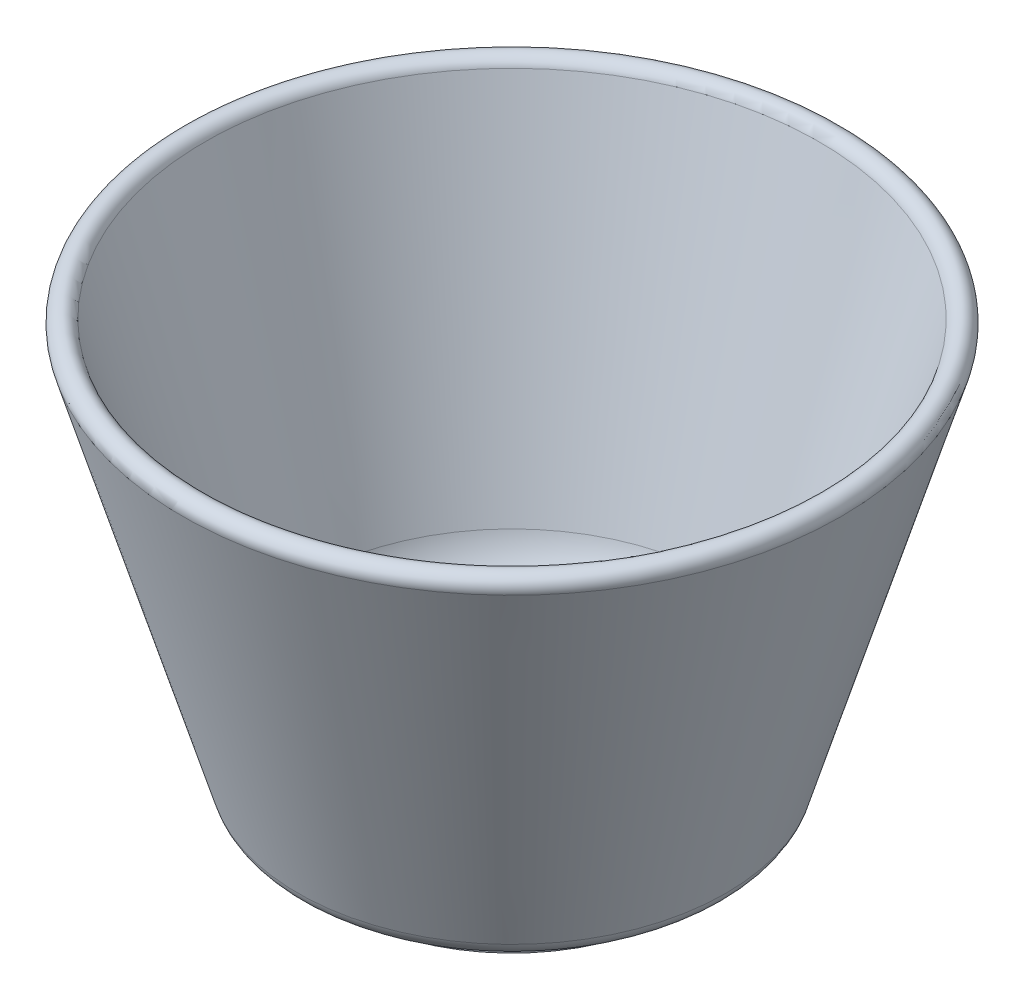
ISO-10303-21;
HEADER;
FILE_DESCRIPTION(('STEP AP214'),'2;1');
FILE_NAME('part.step','',(''),(''),'','','');
FILE_SCHEMA(('AUTOMOTIVE_DESIGN { 1 0 10303 214 1 1 1 1 }'));
ENDSEC;
DATA;
#1=APPLICATION_CONTEXT('core data for automotive mechanical design processes');
#2=APPLICATION_PROTOCOL_DEFINITION('international standard','automotive_design',2000,#1);
#3=PRODUCT_CONTEXT('',#1,'mechanical');
#4=PRODUCT('Part','Part','',(#3));
#5=PRODUCT_RELATED_PRODUCT_CATEGORY('part','',(#4));
#6=PRODUCT_DEFINITION_FORMATION('','',#4);
#7=PRODUCT_DEFINITION_CONTEXT('part definition',#1,'design');
#8=PRODUCT_DEFINITION('design','',#6,#7);
#9=PRODUCT_DEFINITION_SHAPE('','',#8);
#10=(LENGTH_UNIT() NAMED_UNIT(*) SI_UNIT(.MILLI.,.METRE.));
#11=(NAMED_UNIT(*) PLANE_ANGLE_UNIT() SI_UNIT($,.RADIAN.));
#12=(NAMED_UNIT(*) SI_UNIT($,.STERADIAN.) SOLID_ANGLE_UNIT());
#13=UNCERTAINTY_MEASURE_WITH_UNIT(LENGTH_MEASURE(1.E-05),#10,'distance_accuracy_value','');
#14=(GEOMETRIC_REPRESENTATION_CONTEXT(3) GLOBAL_UNCERTAINTY_ASSIGNED_CONTEXT((#13)) GLOBAL_UNIT_ASSIGNED_CONTEXT((#10,
#11,#12)) REPRESENTATION_CONTEXT('',''));
#15=CARTESIAN_POINT('',(0.,0.,0.));
#16=DIRECTION('',(0.,0.,1.));
#17=DIRECTION('',(1.,0.,0.));
#18=AXIS2_PLACEMENT_3D('',#15,#16,#17);
#19=CARTESIAN_POINT('',(-1.66533453693773E-13,49.5689781716506,0.));
#20=DIRECTION('',(0.,-1.,0.));
#21=DIRECTION('',(1.,0.,0.));
#22=AXIS2_PLACEMENT_3D('',#19,#20,#21);
#23=TOROIDAL_SURFACE('',#22,41.4367394278316,1.49999999999999);
#24=CARTESIAN_POINT('',(-1.68555425553902E-13,49.1379563433011,0.));
#25=DIRECTION('',(0.,-1.,0.));
#26=DIRECTION('',(1.,0.,0.));
#27=AXIS2_PLACEMENT_3D('',#24,#25,#26);
#28=CIRCLE('',#27,42.8734788556633);
#29=CARTESIAN_POINT('',(42.8734788556631,49.1379563433012,0.));
#30=VERTEX_POINT('',#29);
#31=EDGE_CURVE('E58',#30,#30,#28,.T.);
#32=ORIENTED_EDGE('',*,*,#31,.F.);
#33=EDGE_LOOP('',(#32));
#34=FACE_BOUND('',#33,.T.);
#35=CARTESIAN_POINT('',(-1.7151244994429E-13,50.0000000000003,0.));
#36=DIRECTION('',(0.,-1.,0.));
#37=DIRECTION('',(1.,0.,0.));
#38=AXIS2_PLACEMENT_3D('',#35,#36,#37);
#39=CIRCLE('',#38,39.9999999999998);
#40=CARTESIAN_POINT('',(39.9999999999997,50.0000000000004,0.));
#41=VERTEX_POINT('',#40);
#42=EDGE_CURVE('E79',#41,#41,#39,.T.);
#43=ORIENTED_EDGE('',*,*,#42,.T.);
#44=EDGE_LOOP('',(#43));
#45=FACE_BOUND('',#44,.T.);
#46=ADVANCED_FACE('F38',(#34,#45),#23,.T.);
#47=CARTESIAN_POINT('',(-1.68555425553902E-13,49.1379563433011,0.));
#48=DIRECTION('',(0.,1.,0.));
#49=DIRECTION('',(-1.,0.,0.));
#50=AXIS2_PLACEMENT_3D('',#47,#48,#49);
#51=CONICAL_SURFACE('',#50,42.8734788556633,0.291456794477864);
#52=CARTESIAN_POINT('',(0.,-0.862043656698952,0.));
#53=DIRECTION('',(0.,-1.,0.));
#54=DIRECTION('',(1.,0.,0.));
#55=AXIS2_PLACEMENT_3D('',#52,#53,#54);
#56=CIRCLE('',#55,27.8734788556635);
#57=CARTESIAN_POINT('',(27.8734788556635,-0.862043656698856,0.));
#58=VERTEX_POINT('',#57);
#59=EDGE_CURVE('E61',#58,#58,#56,.T.);
#60=ORIENTED_EDGE('',*,*,#59,.F.);
#61=EDGE_LOOP('',(#60));
#62=FACE_BOUND('',#61,.T.);
#63=ORIENTED_EDGE('',*,*,#31,.T.);
#64=EDGE_LOOP('',(#63));
#65=FACE_BOUND('',#64,.T.);
#66=ADVANCED_FACE('F108',(#62,#65),#51,.T.);
#67=CARTESIAN_POINT('',(0.,1.10209150833152E-13,0.));
#68=DIRECTION('',(0.,-1.,0.));
#69=DIRECTION('',(1.,0.,0.));
#70=AXIS2_PLACEMENT_3D('',#67,#68,#69);
#71=TOROIDAL_SURFACE('',#70,25.,3.);
#72=CARTESIAN_POINT('',(0.,-2.99999999999989,0.));
#73=DIRECTION('',(0.,-1.,0.));
#74=DIRECTION('',(1.,0.,0.));
#75=AXIS2_PLACEMENT_3D('',#72,#73,#74);
#76=CIRCLE('',#75,25.);
#77=CARTESIAN_POINT('',(25.,-2.99999999999981,0.));
#78=VERTEX_POINT('',#77);
#79=EDGE_CURVE('E64',#78,#78,#76,.T.);
#80=ORIENTED_EDGE('',*,*,#79,.F.);
#81=EDGE_LOOP('',(#80));
#82=FACE_BOUND('',#81,.T.);
#83=ORIENTED_EDGE('',*,*,#59,.T.);
#84=EDGE_LOOP('',(#83));
#85=FACE_BOUND('',#84,.T.);
#86=ADVANCED_FACE('F114',(#82,#85),#71,.T.);
#87=CARTESIAN_POINT('',(-22.,-3.,0.));
#88=DIRECTION('',(0.,1.,0.));
#89=DIRECTION('',(-1.,0.,0.));
#90=AXIS2_PLACEMENT_3D('',#87,#88,#89);
#91=PLANE('',#90);
#92=CARTESIAN_POINT('',(0.,-2.99999999999992,0.));
#93=DIRECTION('',(0.,1.,0.));
#94=DIRECTION('',(-1.,0.,0.));
#95=AXIS2_PLACEMENT_3D('',#92,#93,#94);
#96=CIRCLE('',#95,24.);
#97=CARTESIAN_POINT('',(-24.,-3.,0.));
#98=VERTEX_POINT('',#97);
#99=EDGE_CURVE('E10',#98,#98,#96,.T.);
#100=ORIENTED_EDGE('',*,*,#99,.T.);
#101=EDGE_LOOP('',(#100));
#102=FACE_BOUND('',#101,.T.);
#103=ORIENTED_EDGE('',*,*,#79,.T.);
#104=EDGE_LOOP('',(#103));
#105=FACE_BOUND('',#104,.T.);
#106=ADVANCED_FACE('F142',(#102,#105),#91,.F.);
#107=CARTESIAN_POINT('',(3.25984817666752E-12,-950.324066190647,0.));
#108=DIRECTION('',(0.,-1.,0.));
#109=DIRECTION('',(1.,0.,0.));
#110=AXIS2_PLACEMENT_3D('',#107,#108,#109);
#111=CYLINDRICAL_SURFACE('',#110,22.);
#112=CARTESIAN_POINT('',(0.,-4.99999999999989,0.));
#113=DIRECTION('',(0.,1.,0.));
#114=DIRECTION('',(-1.,0.,0.));
#115=AXIS2_PLACEMENT_3D('',#112,#113,#114);
#116=CIRCLE('',#115,22.);
#117=CARTESIAN_POINT('',(-22.,-4.99999999999997,0.));
#118=VERTEX_POINT('',#117);
#119=EDGE_CURVE('E45',#118,#118,#116,.F.);
#120=ORIENTED_EDGE('',*,*,#119,.T.);
#121=EDGE_LOOP('',(#120));
#122=FACE_BOUND('',#121,.T.);
#123=CARTESIAN_POINT('',(0.,-5.99999999999989,0.));
#124=DIRECTION('',(0.,-1.,0.));
#125=DIRECTION('',(1.,0.,0.));
#126=AXIS2_PLACEMENT_3D('',#123,#124,#125);
#127=CIRCLE('',#126,22.);
#128=CARTESIAN_POINT('',(22.,-5.99999999999982,0.));
#129=VERTEX_POINT('',#128);
#130=EDGE_CURVE('E67',#129,#129,#127,.T.);
#131=ORIENTED_EDGE('',*,*,#130,.F.);
#132=EDGE_LOOP('',(#131));
#133=FACE_BOUND('',#132,.T.);
#134=ADVANCED_FACE('F137',(#122,#133),#111,.T.);
#135=CARTESIAN_POINT('',(-19.,-5.99999999999999,0.));
#136=DIRECTION('',(0.,1.,0.));
#137=DIRECTION('',(-1.,0.,0.));
#138=AXIS2_PLACEMENT_3D('',#135,#136,#137);
#139=PLANE('',#138);
#140=CARTESIAN_POINT('',(0.,-5.99999999999989,0.));
#141=DIRECTION('',(0.,-1.,0.));
#142=DIRECTION('',(1.,0.,0.));
#143=AXIS2_PLACEMENT_3D('',#140,#141,#142);
#144=CIRCLE('',#143,19.);
#145=CARTESIAN_POINT('',(19.,-5.99999999999983,0.));
#146=VERTEX_POINT('',#145);
#147=EDGE_CURVE('E70',#146,#146,#144,.T.);
#148=ORIENTED_EDGE('',*,*,#147,.F.);
#149=EDGE_LOOP('',(#148));
#150=FACE_BOUND('',#149,.T.);
#151=ORIENTED_EDGE('',*,*,#130,.T.);
#152=EDGE_LOOP('',(#151));
#153=FACE_BOUND('',#152,.T.);
#154=ADVANCED_FACE('F131',(#150,#153),#139,.F.);
#155=CARTESIAN_POINT('',(3.25984817666752E-12,-950.324066190647,0.));
#156=DIRECTION('',(0.,-1.,0.));
#157=DIRECTION('',(1.,0.,0.));
#158=AXIS2_PLACEMENT_3D('',#155,#156,#157);
#159=CYLINDRICAL_SURFACE('',#158,19.);
#160=CARTESIAN_POINT('',(0.,-4.99999999999989,0.));
#161=DIRECTION('',(0.,1.,0.));
#162=DIRECTION('',(-1.,0.,0.));
#163=AXIS2_PLACEMENT_3D('',#160,#161,#162);
#164=CIRCLE('',#163,19.);
#165=CARTESIAN_POINT('',(-19.,-4.99999999999996,0.));
#166=VERTEX_POINT('',#165);
#167=EDGE_CURVE('E49',#166,#166,#164,.T.);
#168=ORIENTED_EDGE('',*,*,#167,.T.);
#169=EDGE_LOOP('',(#168));
#170=FACE_BOUND('',#169,.T.);
#171=ORIENTED_EDGE('',*,*,#147,.T.);
#172=EDGE_LOOP('',(#171));
#173=FACE_BOUND('',#172,.T.);
#174=ADVANCED_FACE('F104',(#170,#173),#159,.F.);
#175=CARTESIAN_POINT('',(-19.,-3.00000000000003,0.));
#176=DIRECTION('',(0.,1.,0.));
#177=DIRECTION('',(-1.,0.,0.));
#178=AXIS2_PLACEMENT_3D('',#175,#176,#177);
#179=PLANE('',#178);
#180=CARTESIAN_POINT('',(0.,-2.99999999999997,0.));
#181=DIRECTION('',(0.,1.,0.));
#182=DIRECTION('',(-1.,0.,0.));
#183=AXIS2_PLACEMENT_3D('',#180,#181,#182);
#184=CIRCLE('',#183,17.);
#185=CARTESIAN_POINT('',(-17.,-3.00000000000002,0.));
#186=VERTEX_POINT('',#185);
#187=EDGE_CURVE('E53',#186,#186,#184,.F.);
#188=ORIENTED_EDGE('',*,*,#187,.T.);
#189=EDGE_LOOP('',(#188));
#190=FACE_BOUND('',#189,.T.);
#191=ADVANCED_FACE('F99',(#190),#179,.F.);
#192=CARTESIAN_POINT('',(-17.5596934910894,0.,0.));
#193=DIRECTION('',(0.,-1.,0.));
#194=DIRECTION('',(1.,0.,0.));
#195=AXIS2_PLACEMENT_3D('',#192,#193,#194);
#196=PLANE('',#195);
#197=CARTESIAN_POINT('',(0.,1.11022302462516E-13,0.));
#198=DIRECTION('',(0.,-1.,0.));
#199=DIRECTION('',(1.,0.,0.));
#200=AXIS2_PLACEMENT_3D('',#197,#198,#199);
#201=CIRCLE('',#200,17.5596934910894);
#202=CARTESIAN_POINT('',(17.5596934910894,1.71256423481066E-13,0.));
#203=VERTEX_POINT('',#202);
#204=EDGE_CURVE('E73',#203,#203,#201,.T.);
#205=ORIENTED_EDGE('',*,*,#204,.F.);
#206=EDGE_LOOP('',(#205));
#207=FACE_BOUND('',#206,.T.);
#208=ADVANCED_FACE('F94',(#207),#196,.F.);
#209=CARTESIAN_POINT('',(0.,10.0000000000001,0.));
#210=DIRECTION('',(0.,-1.,0.));
#211=DIRECTION('',(1.,0.,0.));
#212=AXIS2_PLACEMENT_3D('',#209,#210,#211);
#213=TOROIDAL_SURFACE('',#212,17.5596934910894,10.);
#214=CARTESIAN_POINT('',(0.,7.12652114433676,0.));
#215=DIRECTION('',(0.,-1.,0.));
#216=DIRECTION('',(1.,0.,0.));
#217=AXIS2_PLACEMENT_3D('',#214,#215,#216);
#218=CIRCLE('',#217,27.137956343301);
#219=CARTESIAN_POINT('',(27.1379563433009,7.12652114433685,0.));
#220=VERTEX_POINT('',#219);
#221=EDGE_CURVE('E76',#220,#220,#218,.T.);
#222=ORIENTED_EDGE('',*,*,#221,.F.);
#223=EDGE_LOOP('',(#222));
#224=FACE_BOUND('',#223,.T.);
#225=ORIENTED_EDGE('',*,*,#204,.T.);
#226=EDGE_LOOP('',(#225));
#227=FACE_BOUND('',#226,.T.);
#228=ADVANCED_FACE('F88',(#224,#227),#213,.F.);
#229=CARTESIAN_POINT('',(0.,7.12652114433676,0.));
#230=DIRECTION('',(0.,1.,0.));
#231=DIRECTION('',(-1.,0.,0.));
#232=AXIS2_PLACEMENT_3D('',#229,#230,#231);
#233=CONICAL_SURFACE('',#232,27.137956343301,0.291456794477863);
#234=ORIENTED_EDGE('',*,*,#42,.F.);
#235=EDGE_LOOP('',(#234));
#236=FACE_BOUND('',#235,.T.);
#237=ORIENTED_EDGE('',*,*,#221,.T.);
#238=EDGE_LOOP('',(#237));
#239=FACE_BOUND('',#238,.T.);
#240=ADVANCED_FACE('F84',(#236,#239),#233,.F.);
#241=CARTESIAN_POINT('',(0.,-4.99999999999989,0.));
#242=DIRECTION('',(0.,1.,0.));
#243=DIRECTION('',(-1.,0.,0.));
#244=AXIS2_PLACEMENT_3D('',#241,#242,#243);
#245=TOROIDAL_SURFACE('',#244,17.,2.);
#246=ORIENTED_EDGE('',*,*,#167,.F.);
#247=EDGE_LOOP('',(#246));
#248=FACE_BOUND('',#247,.T.);
#249=ORIENTED_EDGE('',*,*,#187,.F.);
#250=EDGE_LOOP('',(#249));
#251=FACE_BOUND('',#250,.T.);
#252=ADVANCED_FACE('F87',(#248,#251),#245,.F.);
#253=CARTESIAN_POINT('',(0.,-4.99999999999989,0.));
#254=DIRECTION('',(0.,1.,0.));
#255=DIRECTION('',(-1.,0.,0.));
#256=AXIS2_PLACEMENT_3D('',#253,#254,#255);
#257=TOROIDAL_SURFACE('',#256,24.,2.);
#258=ORIENTED_EDGE('',*,*,#99,.F.);
#259=EDGE_LOOP('',(#258));
#260=FACE_BOUND('',#259,.T.);
#261=ORIENTED_EDGE('',*,*,#119,.F.);
#262=EDGE_LOOP('',(#261));
#263=FACE_BOUND('',#262,.T.);
#264=ADVANCED_FACE('F40',(#260,#263),#257,.F.);
#265=CLOSED_SHELL('',(#46,#66,#86,#106,#134,#154,#174,#191,#208,#228,#240,#252,#264));
#266=MANIFOLD_SOLID_BREP('B2',#265);
#267=ADVANCED_BREP_SHAPE_REPRESENTATION('',(#18,#266),#14);
#268=SHAPE_DEFINITION_REPRESENTATION(#9,#267);
ENDSEC;
END-ISO-10303-21;
